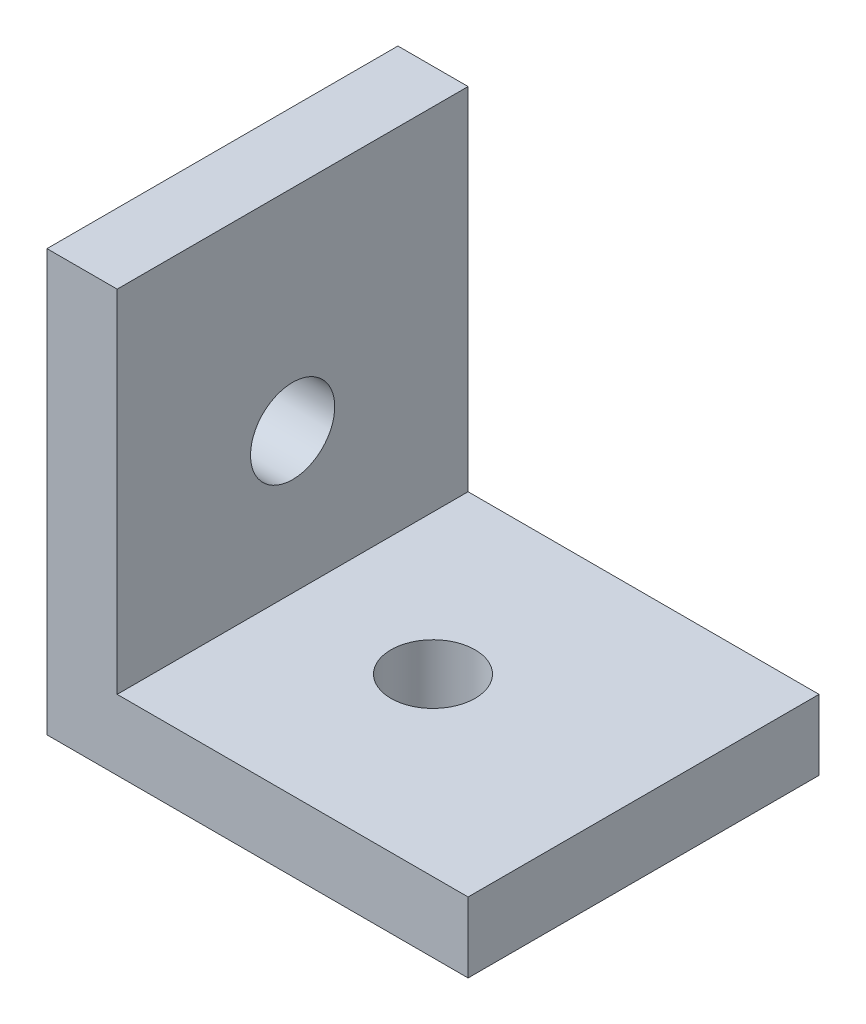
ISO-10303-21;
HEADER;
FILE_DESCRIPTION(('STEP AP214'),'2;1');
FILE_NAME('part.step','',(''),(''),'','','');
FILE_SCHEMA(('AUTOMOTIVE_DESIGN { 1 0 10303 214 1 1 1 1 }'));
ENDSEC;
DATA;
#1=APPLICATION_CONTEXT('core data for automotive mechanical design processes');
#2=APPLICATION_PROTOCOL_DEFINITION('international standard','automotive_design',2000,#1);
#3=PRODUCT_CONTEXT('',#1,'mechanical');
#4=PRODUCT('Part','Part','',(#3));
#5=PRODUCT_RELATED_PRODUCT_CATEGORY('part','',(#4));
#6=PRODUCT_DEFINITION_FORMATION('','',#4);
#7=PRODUCT_DEFINITION_CONTEXT('part definition',#1,'design');
#8=PRODUCT_DEFINITION('design','',#6,#7);
#9=PRODUCT_DEFINITION_SHAPE('','',#8);
#10=(LENGTH_UNIT() NAMED_UNIT(*) SI_UNIT(.MILLI.,.METRE.));
#11=(NAMED_UNIT(*) PLANE_ANGLE_UNIT() SI_UNIT($,.RADIAN.));
#12=(NAMED_UNIT(*) SI_UNIT($,.STERADIAN.) SOLID_ANGLE_UNIT());
#13=UNCERTAINTY_MEASURE_WITH_UNIT(LENGTH_MEASURE(1.E-05),#10,'distance_accuracy_value','');
#14=(GEOMETRIC_REPRESENTATION_CONTEXT(3) GLOBAL_UNCERTAINTY_ASSIGNED_CONTEXT((#13)) GLOBAL_UNIT_ASSIGNED_CONTEXT((#10,
#11,#12)) REPRESENTATION_CONTEXT('',''));
#15=CARTESIAN_POINT('',(0.,0.,0.));
#16=DIRECTION('',(0.,0.,1.));
#17=DIRECTION('',(1.,0.,0.));
#18=AXIS2_PLACEMENT_3D('',#15,#16,#17);
#19=CARTESIAN_POINT('',(0.,0.,12.5));
#20=DIRECTION('',(0.,1.,0.));
#21=DIRECTION('',(-1.,0.,0.));
#22=AXIS2_PLACEMENT_3D('',#19,#20,#21);
#23=PLANE('',#22);
#24=CARTESIAN_POINT('',(15.,0.,0.));
#25=DIRECTION('',(0.,-1.,0.));
#26=DIRECTION('',(1.,0.,0.));
#27=AXIS2_PLACEMENT_3D('',#24,#25,#26);
#28=CIRCLE('',#27,3.);
#29=CARTESIAN_POINT('',(18.,0.,0.));
#30=VERTEX_POINT('',#29);
#31=EDGE_CURVE('E165',#30,#30,#28,.T.);
#32=ORIENTED_EDGE('',*,*,#31,.F.);
#33=EDGE_LOOP('',(#32));
#34=FACE_BOUND('',#33,.T.);
#35=DIRECTION('',(1.,0.,0.));
#36=VECTOR('',#35,1.);
#37=CARTESIAN_POINT('',(0.,0.,-12.5));
#38=LINE('',#37,#36);
#39=CARTESIAN_POINT('',(0.,0.,-12.5));
#40=VERTEX_POINT('',#39);
#41=CARTESIAN_POINT('',(30.,0.,-12.5));
#42=VERTEX_POINT('',#41);
#43=EDGE_CURVE('E120',#40,#42,#38,.T.);
#44=ORIENTED_EDGE('',*,*,#43,.T.);
#45=DIRECTION('',(0.,0.,-1.));
#46=VECTOR('',#45,1.);
#47=CARTESIAN_POINT('',(30.,0.,12.5));
#48=LINE('',#47,#46);
#49=CARTESIAN_POINT('',(30.,0.,12.5));
#50=VERTEX_POINT('',#49);
#51=EDGE_CURVE('E11',#50,#42,#48,.T.);
#52=ORIENTED_EDGE('',*,*,#51,.F.);
#53=DIRECTION('',(1.,0.,0.));
#54=VECTOR('',#53,1.);
#55=CARTESIAN_POINT('',(0.,0.,12.5));
#56=LINE('',#55,#54);
#57=CARTESIAN_POINT('',(0.,0.,12.5));
#58=VERTEX_POINT('',#57);
#59=EDGE_CURVE('E131',#58,#50,#56,.T.);
#60=ORIENTED_EDGE('',*,*,#59,.F.);
#61=DIRECTION('',(0.,0.,-1.));
#62=VECTOR('',#61,1.);
#63=CARTESIAN_POINT('',(0.,0.,12.5));
#64=LINE('',#63,#62);
#65=EDGE_CURVE('E116',#58,#40,#64,.T.);
#66=ORIENTED_EDGE('',*,*,#65,.T.);
#67=EDGE_LOOP('',(#44,#52,#60,#66));
#68=FACE_BOUND('',#67,.T.);
#69=ADVANCED_FACE('F35',(#34,#68),#23,.F.);
#70=CARTESIAN_POINT('',(30.,0.,12.5));
#71=DIRECTION('',(-1.,0.,0.));
#72=DIRECTION('',(0.,-1.,0.));
#73=AXIS2_PLACEMENT_3D('',#70,#71,#72);
#74=PLANE('',#73);
#75=DIRECTION('',(0.,1.,0.));
#76=VECTOR('',#75,1.);
#77=CARTESIAN_POINT('',(30.,0.,-12.5));
#78=LINE('',#77,#76);
#79=CARTESIAN_POINT('',(30.,4.99999999999991,-12.5));
#80=VERTEX_POINT('',#79);
#81=EDGE_CURVE('E123',#42,#80,#78,.T.);
#82=ORIENTED_EDGE('',*,*,#81,.T.);
#83=DIRECTION('',(0.,0.,-1.));
#84=VECTOR('',#83,1.);
#85=CARTESIAN_POINT('',(30.,4.99999999999991,12.5));
#86=LINE('',#85,#84);
#87=CARTESIAN_POINT('',(30.,4.99999999999991,12.5));
#88=VERTEX_POINT('',#87);
#89=EDGE_CURVE('E44',#88,#80,#86,.T.);
#90=ORIENTED_EDGE('',*,*,#89,.F.);
#91=DIRECTION('',(0.,1.,0.));
#92=VECTOR('',#91,1.);
#93=CARTESIAN_POINT('',(30.,0.,12.5));
#94=LINE('',#93,#92);
#95=EDGE_CURVE('E89',#50,#88,#94,.T.);
#96=ORIENTED_EDGE('',*,*,#95,.F.);
#97=ORIENTED_EDGE('',*,*,#51,.T.);
#98=EDGE_LOOP('',(#82,#90,#96,#97));
#99=FACE_BOUND('',#98,.T.);
#100=ADVANCED_FACE('F158',(#99),#74,.F.);
#101=CARTESIAN_POINT('',(30.,4.99999999999991,12.5));
#102=DIRECTION('',(0.,-1.,0.));
#103=DIRECTION('',(1.,0.,0.));
#104=AXIS2_PLACEMENT_3D('',#101,#102,#103);
#105=PLANE('',#104);
#106=CARTESIAN_POINT('',(15.,4.99999999999996,0.));
#107=DIRECTION('',(0.,-1.,0.));
#108=DIRECTION('',(1.,0.,0.));
#109=AXIS2_PLACEMENT_3D('',#106,#107,#108);
#110=CIRCLE('',#109,3.);
#111=CARTESIAN_POINT('',(18.,4.99999999999995,0.));
#112=VERTEX_POINT('',#111);
#113=EDGE_CURVE('E38',#112,#112,#110,.T.);
#114=ORIENTED_EDGE('',*,*,#113,.T.);
#115=EDGE_LOOP('',(#114));
#116=FACE_BOUND('',#115,.T.);
#117=DIRECTION('',(-1.,0.,0.));
#118=VECTOR('',#117,1.);
#119=CARTESIAN_POINT('',(30.,4.99999999999991,-12.5));
#120=LINE('',#119,#118);
#121=CARTESIAN_POINT('',(5.00000000000001,4.99999999999999,-12.5));
#122=VERTEX_POINT('',#121);
#123=EDGE_CURVE('E126',#80,#122,#120,.T.);
#124=ORIENTED_EDGE('',*,*,#123,.T.);
#125=DIRECTION('',(0.,0.,-1.));
#126=VECTOR('',#125,1.);
#127=CARTESIAN_POINT('',(5.00000000000001,4.99999999999999,12.5));
#128=LINE('',#127,#126);
#129=CARTESIAN_POINT('',(5.00000000000001,4.99999999999999,12.5));
#130=VERTEX_POINT('',#129);
#131=EDGE_CURVE('E111',#130,#122,#128,.T.);
#132=ORIENTED_EDGE('',*,*,#131,.F.);
#133=DIRECTION('',(-1.,0.,0.));
#134=VECTOR('',#133,1.);
#135=CARTESIAN_POINT('',(30.,4.99999999999991,12.5));
#136=LINE('',#135,#134);
#137=EDGE_CURVE('E102',#88,#130,#136,.T.);
#138=ORIENTED_EDGE('',*,*,#137,.F.);
#139=ORIENTED_EDGE('',*,*,#89,.T.);
#140=EDGE_LOOP('',(#124,#132,#138,#139));
#141=FACE_BOUND('',#140,.T.);
#142=ADVANCED_FACE('F138',(#116,#141),#105,.F.);
#143=CARTESIAN_POINT('',(5.,30.,12.5));
#144=DIRECTION('',(-1.,0.,0.));
#145=DIRECTION('',(0.,-1.,0.));
#146=AXIS2_PLACEMENT_3D('',#143,#144,#145);
#147=PLANE('',#146);
#148=CARTESIAN_POINT('',(5.,15.,0.));
#149=DIRECTION('',(-1.,0.,0.));
#150=DIRECTION('',(0.,-1.,0.));
#151=AXIS2_PLACEMENT_3D('',#148,#149,#150);
#152=CIRCLE('',#151,3.);
#153=CARTESIAN_POINT('',(5.00000000000001,12.,0.));
#154=VERTEX_POINT('',#153);
#155=EDGE_CURVE('E124',#154,#154,#152,.T.);
#156=ORIENTED_EDGE('',*,*,#155,.T.);
#157=EDGE_LOOP('',(#156));
#158=FACE_BOUND('',#157,.T.);
#159=DIRECTION('',(0.,1.,0.));
#160=VECTOR('',#159,1.);
#161=CARTESIAN_POINT('',(5.,30.,-12.5));
#162=LINE('',#161,#160);
#163=CARTESIAN_POINT('',(5.,30.,-12.5));
#164=VERTEX_POINT('',#163);
#165=EDGE_CURVE('E110',#122,#164,#162,.T.);
#166=ORIENTED_EDGE('',*,*,#165,.T.);
#167=DIRECTION('',(0.,0.,-1.));
#168=VECTOR('',#167,1.);
#169=CARTESIAN_POINT('',(5.,30.,12.5));
#170=LINE('',#169,#168);
#171=CARTESIAN_POINT('',(5.,30.,12.5));
#172=VERTEX_POINT('',#171);
#173=EDGE_CURVE('E107',#172,#164,#170,.T.);
#174=ORIENTED_EDGE('',*,*,#173,.F.);
#175=DIRECTION('',(0.,1.,0.));
#176=VECTOR('',#175,1.);
#177=CARTESIAN_POINT('',(5.,30.,12.5));
#178=LINE('',#177,#176);
#179=EDGE_CURVE('E96',#130,#172,#178,.T.);
#180=ORIENTED_EDGE('',*,*,#179,.F.);
#181=ORIENTED_EDGE('',*,*,#131,.T.);
#182=EDGE_LOOP('',(#166,#174,#180,#181));
#183=FACE_BOUND('',#182,.T.);
#184=ADVANCED_FACE('F108',(#158,#183),#147,.F.);
#185=CARTESIAN_POINT('',(0.,30.,12.5));
#186=DIRECTION('',(0.,-1.,0.));
#187=DIRECTION('',(0.,0.,-1.));
#188=AXIS2_PLACEMENT_3D('',#185,#186,#187);
#189=PLANE('',#188);
#190=DIRECTION('',(-1.,0.,0.));
#191=VECTOR('',#190,1.);
#192=CARTESIAN_POINT('',(0.,30.,-12.5));
#193=LINE('',#192,#191);
#194=CARTESIAN_POINT('',(0.,30.,-12.5));
#195=VERTEX_POINT('',#194);
#196=EDGE_CURVE('E75',#164,#195,#193,.T.);
#197=ORIENTED_EDGE('',*,*,#196,.T.);
#198=DIRECTION('',(0.,0.,-1.));
#199=VECTOR('',#198,1.);
#200=CARTESIAN_POINT('',(0.,30.,12.5));
#201=LINE('',#200,#199);
#202=CARTESIAN_POINT('',(0.,30.,12.5));
#203=VERTEX_POINT('',#202);
#204=EDGE_CURVE('E112',#203,#195,#201,.T.);
#205=ORIENTED_EDGE('',*,*,#204,.F.);
#206=DIRECTION('',(-1.,0.,0.));
#207=VECTOR('',#206,1.);
#208=CARTESIAN_POINT('',(0.,30.,12.5));
#209=LINE('',#208,#207);
#210=EDGE_CURVE('E100',#172,#203,#209,.T.);
#211=ORIENTED_EDGE('',*,*,#210,.F.);
#212=ORIENTED_EDGE('',*,*,#173,.T.);
#213=EDGE_LOOP('',(#197,#205,#211,#212));
#214=FACE_BOUND('',#213,.T.);
#215=ADVANCED_FACE('F114',(#214),#189,.F.);
#216=CARTESIAN_POINT('',(0.,0.,12.5));
#217=DIRECTION('',(1.,0.,0.));
#218=DIRECTION('',(0.,0.,-1.));
#219=AXIS2_PLACEMENT_3D('',#216,#217,#218);
#220=PLANE('',#219);
#221=CARTESIAN_POINT('',(0.,15.,0.));
#222=DIRECTION('',(-1.,0.,0.));
#223=DIRECTION('',(0.,0.,1.));
#224=AXIS2_PLACEMENT_3D('',#221,#222,#223);
#225=CIRCLE('',#224,3.);
#226=CARTESIAN_POINT('',(0.,15.,3.));
#227=VERTEX_POINT('',#226);
#228=EDGE_CURVE('E169',#227,#227,#225,.T.);
#229=ORIENTED_EDGE('',*,*,#228,.F.);
#230=EDGE_LOOP('',(#229));
#231=FACE_BOUND('',#230,.T.);
#232=DIRECTION('',(0.,-1.,0.));
#233=VECTOR('',#232,1.);
#234=CARTESIAN_POINT('',(0.,0.,-12.5));
#235=LINE('',#234,#233);
#236=EDGE_CURVE('E81',#195,#40,#235,.T.);
#237=ORIENTED_EDGE('',*,*,#236,.T.);
#238=ORIENTED_EDGE('',*,*,#65,.F.);
#239=DIRECTION('',(0.,-1.,0.));
#240=VECTOR('',#239,1.);
#241=CARTESIAN_POINT('',(0.,0.,12.5));
#242=LINE('',#241,#240);
#243=EDGE_CURVE('E52',#203,#58,#242,.T.);
#244=ORIENTED_EDGE('',*,*,#243,.F.);
#245=ORIENTED_EDGE('',*,*,#204,.T.);
#246=EDGE_LOOP('',(#237,#238,#244,#245));
#247=FACE_BOUND('',#246,.T.);
#248=ADVANCED_FACE('F145',(#231,#247),#220,.F.);
#249=CARTESIAN_POINT('',(0.,0.,12.5));
#250=DIRECTION('',(0.,0.,1.));
#251=DIRECTION('',(1.,0.,0.));
#252=AXIS2_PLACEMENT_3D('',#249,#250,#251);
#253=PLANE('',#252);
#254=ORIENTED_EDGE('',*,*,#59,.T.);
#255=ORIENTED_EDGE('',*,*,#95,.T.);
#256=ORIENTED_EDGE('',*,*,#137,.T.);
#257=ORIENTED_EDGE('',*,*,#179,.T.);
#258=ORIENTED_EDGE('',*,*,#210,.T.);
#259=ORIENTED_EDGE('',*,*,#243,.T.);
#260=EDGE_LOOP('',(#254,#255,#256,#257,#258,#259));
#261=FACE_BOUND('',#260,.T.);
#262=ADVANCED_FACE('F98',(#261),#253,.T.);
#263=CARTESIAN_POINT('',(0.,0.,-12.5));
#264=DIRECTION('',(0.,0.,1.));
#265=DIRECTION('',(1.,0.,0.));
#266=AXIS2_PLACEMENT_3D('',#263,#264,#265);
#267=PLANE('',#266);
#268=ORIENTED_EDGE('',*,*,#43,.F.);
#269=ORIENTED_EDGE('',*,*,#236,.F.);
#270=ORIENTED_EDGE('',*,*,#196,.F.);
#271=ORIENTED_EDGE('',*,*,#165,.F.);
#272=ORIENTED_EDGE('',*,*,#123,.F.);
#273=ORIENTED_EDGE('',*,*,#81,.F.);
#274=EDGE_LOOP('',(#268,#269,#270,#271,#272,#273));
#275=FACE_BOUND('',#274,.T.);
#276=ADVANCED_FACE('F141',(#275),#267,.F.);
#277=CARTESIAN_POINT('',(30.,15.,0.));
#278=DIRECTION('',(-1.,0.,0.));
#279=DIRECTION('',(0.,0.,1.));
#280=AXIS2_PLACEMENT_3D('',#277,#278,#279);
#281=CYLINDRICAL_SURFACE('',#280,3.);
#282=ORIENTED_EDGE('',*,*,#228,.T.);
#283=EDGE_LOOP('',(#282));
#284=FACE_BOUND('',#283,.T.);
#285=ORIENTED_EDGE('',*,*,#155,.F.);
#286=EDGE_LOOP('',(#285));
#287=FACE_BOUND('',#286,.T.);
#288=ADVANCED_FACE('F179',(#284,#287),#281,.F.);
#289=CARTESIAN_POINT('',(15.0000000000001,30.,0.));
#290=DIRECTION('',(0.,-1.,0.));
#291=DIRECTION('',(1.,0.,0.));
#292=AXIS2_PLACEMENT_3D('',#289,#290,#291);
#293=CYLINDRICAL_SURFACE('',#292,3.);
#294=ORIENTED_EDGE('',*,*,#31,.T.);
#295=EDGE_LOOP('',(#294));
#296=FACE_BOUND('',#295,.T.);
#297=ORIENTED_EDGE('',*,*,#113,.F.);
#298=EDGE_LOOP('',(#297));
#299=FACE_BOUND('',#298,.T.);
#300=ADVANCED_FACE('F181',(#296,#299),#293,.F.);
#301=CLOSED_SHELL('',(#69,#100,#142,#184,#215,#248,#262,#276,#288,#300));
#302=MANIFOLD_SOLID_BREP('B2',#301);
#303=ADVANCED_BREP_SHAPE_REPRESENTATION('',(#18,#302),#14);
#304=SHAPE_DEFINITION_REPRESENTATION(#9,#303);
ENDSEC;
END-ISO-10303-21;
